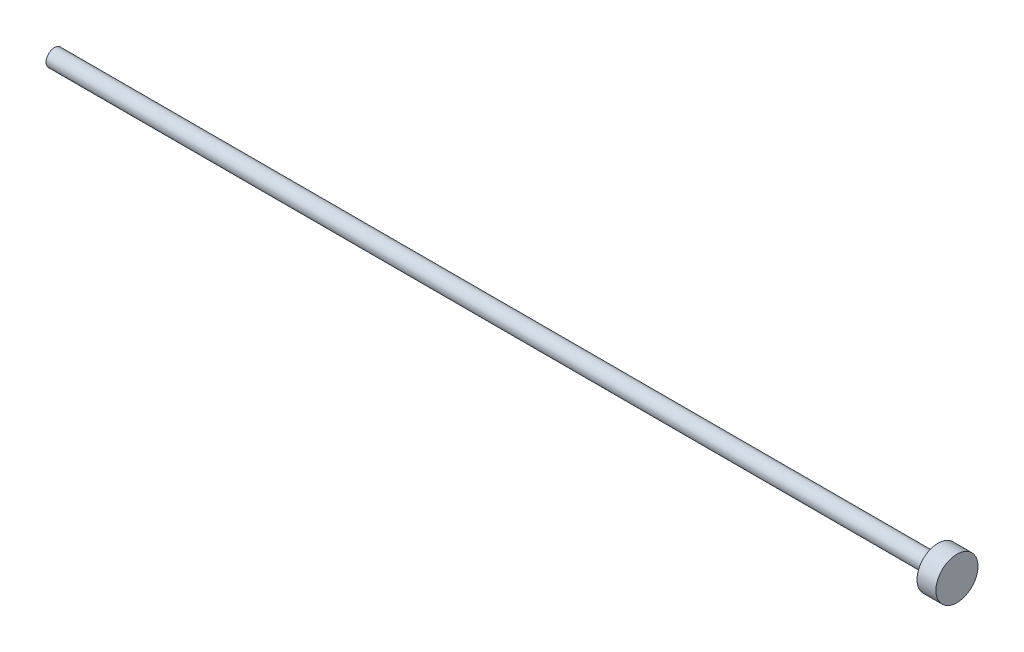
ISO-10303-21;
HEADER;
FILE_DESCRIPTION(('STEP AP214'),'2;1');
FILE_NAME('part.step','',(''),(''),'','','');
FILE_SCHEMA(('AUTOMOTIVE_DESIGN { 1 0 10303 214 1 1 1 1 }'));
ENDSEC;
DATA;
#1=APPLICATION_CONTEXT('core data for automotive mechanical design processes');
#2=APPLICATION_PROTOCOL_DEFINITION('international standard','automotive_design',2000,#1);
#3=PRODUCT_CONTEXT('',#1,'mechanical');
#4=PRODUCT('Part','Part','',(#3));
#5=PRODUCT_RELATED_PRODUCT_CATEGORY('part','',(#4));
#6=PRODUCT_DEFINITION_FORMATION('','',#4);
#7=PRODUCT_DEFINITION_CONTEXT('part definition',#1,'design');
#8=PRODUCT_DEFINITION('design','',#6,#7);
#9=PRODUCT_DEFINITION_SHAPE('','',#8);
#10=(LENGTH_UNIT() NAMED_UNIT(*) SI_UNIT(.MILLI.,.METRE.));
#11=(NAMED_UNIT(*) PLANE_ANGLE_UNIT() SI_UNIT($,.RADIAN.));
#12=(NAMED_UNIT(*) SI_UNIT($,.STERADIAN.) SOLID_ANGLE_UNIT());
#13=UNCERTAINTY_MEASURE_WITH_UNIT(LENGTH_MEASURE(1.E-05),#10,'distance_accuracy_value','');
#14=(GEOMETRIC_REPRESENTATION_CONTEXT(3) GLOBAL_UNCERTAINTY_ASSIGNED_CONTEXT((#13)) GLOBAL_UNIT_ASSIGNED_CONTEXT((#10,
#11,#12)) REPRESENTATION_CONTEXT('',''));
#15=CARTESIAN_POINT('',(0.,0.,0.));
#16=DIRECTION('',(0.,0.,1.));
#17=DIRECTION('',(1.,0.,0.));
#18=AXIS2_PLACEMENT_3D('',#15,#16,#17);
#19=CARTESIAN_POINT('',(4.5,0.,0.));
#20=DIRECTION('',(-1.,0.,0.));
#21=DIRECTION('',(0.,0.,1.));
#22=AXIS2_PLACEMENT_3D('',#19,#20,#21);
#23=CYLINDRICAL_SURFACE('',#22,5.);
#24=CARTESIAN_POINT('',(4.5,0.,0.));
#25=DIRECTION('',(1.,0.,0.));
#26=DIRECTION('',(0.,0.,-1.));
#27=AXIS2_PLACEMENT_3D('',#24,#25,#26);
#28=CIRCLE('',#27,5.);
#29=CARTESIAN_POINT('',(4.5,0.,-5.));
#30=VERTEX_POINT('',#29);
#31=EDGE_CURVE('E49',#30,#30,#28,.T.);
#32=ORIENTED_EDGE('',*,*,#31,.F.);
#33=EDGE_LOOP('',(#32));
#34=FACE_BOUND('',#33,.T.);
#35=CARTESIAN_POINT('',(0.,0.,0.));
#36=DIRECTION('',(1.,0.,0.));
#37=DIRECTION('',(0.,0.,-1.));
#38=AXIS2_PLACEMENT_3D('',#35,#36,#37);
#39=CIRCLE('',#38,5.);
#40=CARTESIAN_POINT('',(0.,0.,-5.));
#41=VERTEX_POINT('',#40);
#42=EDGE_CURVE('E44',#41,#41,#39,.T.);
#43=ORIENTED_EDGE('',*,*,#42,.T.);
#44=EDGE_LOOP('',(#43));
#45=FACE_BOUND('',#44,.T.);
#46=ADVANCED_FACE('F41',(#34,#45),#23,.T.);
#47=CARTESIAN_POINT('',(4.5,0.,0.));
#48=DIRECTION('',(1.,0.,0.));
#49=DIRECTION('',(0.,0.,-1.));
#50=AXIS2_PLACEMENT_3D('',#47,#48,#49);
#51=PLANE('',#50);
#52=ORIENTED_EDGE('',*,*,#31,.T.);
#53=EDGE_LOOP('',(#52));
#54=FACE_BOUND('',#53,.T.);
#55=ADVANCED_FACE('F69',(#54),#51,.T.);
#56=CARTESIAN_POINT('',(0.,0.,0.));
#57=DIRECTION('',(1.,0.,0.));
#58=DIRECTION('',(0.,0.,-1.));
#59=AXIS2_PLACEMENT_3D('',#56,#57,#58);
#60=PLANE('',#59);
#61=CARTESIAN_POINT('',(0.,0.,0.));
#62=DIRECTION('',(-1.,0.,0.));
#63=DIRECTION('',(0.,0.,1.));
#64=AXIS2_PLACEMENT_3D('',#61,#62,#63);
#65=CIRCLE('',#64,2.);
#66=CARTESIAN_POINT('',(0.,0.,2.));
#67=VERTEX_POINT('',#66);
#68=EDGE_CURVE('E10',#67,#67,#65,.T.);
#69=ORIENTED_EDGE('',*,*,#68,.F.);
#70=EDGE_LOOP('',(#69));
#71=FACE_BOUND('',#70,.T.);
#72=ORIENTED_EDGE('',*,*,#42,.F.);
#73=EDGE_LOOP('',(#72));
#74=FACE_BOUND('',#73,.T.);
#75=ADVANCED_FACE('F66',(#71,#74),#60,.F.);
#76=CARTESIAN_POINT('',(-210.,0.,0.));
#77=DIRECTION('',(1.,0.,0.));
#78=DIRECTION('',(0.,0.,-1.));
#79=AXIS2_PLACEMENT_3D('',#76,#77,#78);
#80=CYLINDRICAL_SURFACE('',#79,2.);
#81=CARTESIAN_POINT('',(-210.,0.,0.));
#82=DIRECTION('',(-1.,0.,0.));
#83=DIRECTION('',(0.,0.,1.));
#84=AXIS2_PLACEMENT_3D('',#81,#82,#83);
#85=CIRCLE('',#84,2.);
#86=CARTESIAN_POINT('',(-210.,0.,2.));
#87=VERTEX_POINT('',#86);
#88=EDGE_CURVE('E56',#87,#87,#85,.T.);
#89=ORIENTED_EDGE('',*,*,#88,.F.);
#90=EDGE_LOOP('',(#89));
#91=FACE_BOUND('',#90,.T.);
#92=ORIENTED_EDGE('',*,*,#68,.T.);
#93=EDGE_LOOP('',(#92));
#94=FACE_BOUND('',#93,.T.);
#95=ADVANCED_FACE('F68',(#91,#94),#80,.T.);
#96=CARTESIAN_POINT('',(-210.,0.,0.));
#97=DIRECTION('',(-1.,0.,0.));
#98=DIRECTION('',(0.,0.,1.));
#99=AXIS2_PLACEMENT_3D('',#96,#97,#98);
#100=PLANE('',#99);
#101=ORIENTED_EDGE('',*,*,#88,.T.);
#102=EDGE_LOOP('',(#101));
#103=FACE_BOUND('',#102,.T.);
#104=ADVANCED_FACE('F75',(#103),#100,.T.);
#105=CLOSED_SHELL('',(#46,#55,#75,#95,#104));
#106=MANIFOLD_SOLID_BREP('B2',#105);
#107=ADVANCED_BREP_SHAPE_REPRESENTATION('',(#18,#106),#14);
#108=SHAPE_DEFINITION_REPRESENTATION(#9,#107);
ENDSEC;
END-ISO-10303-21;
